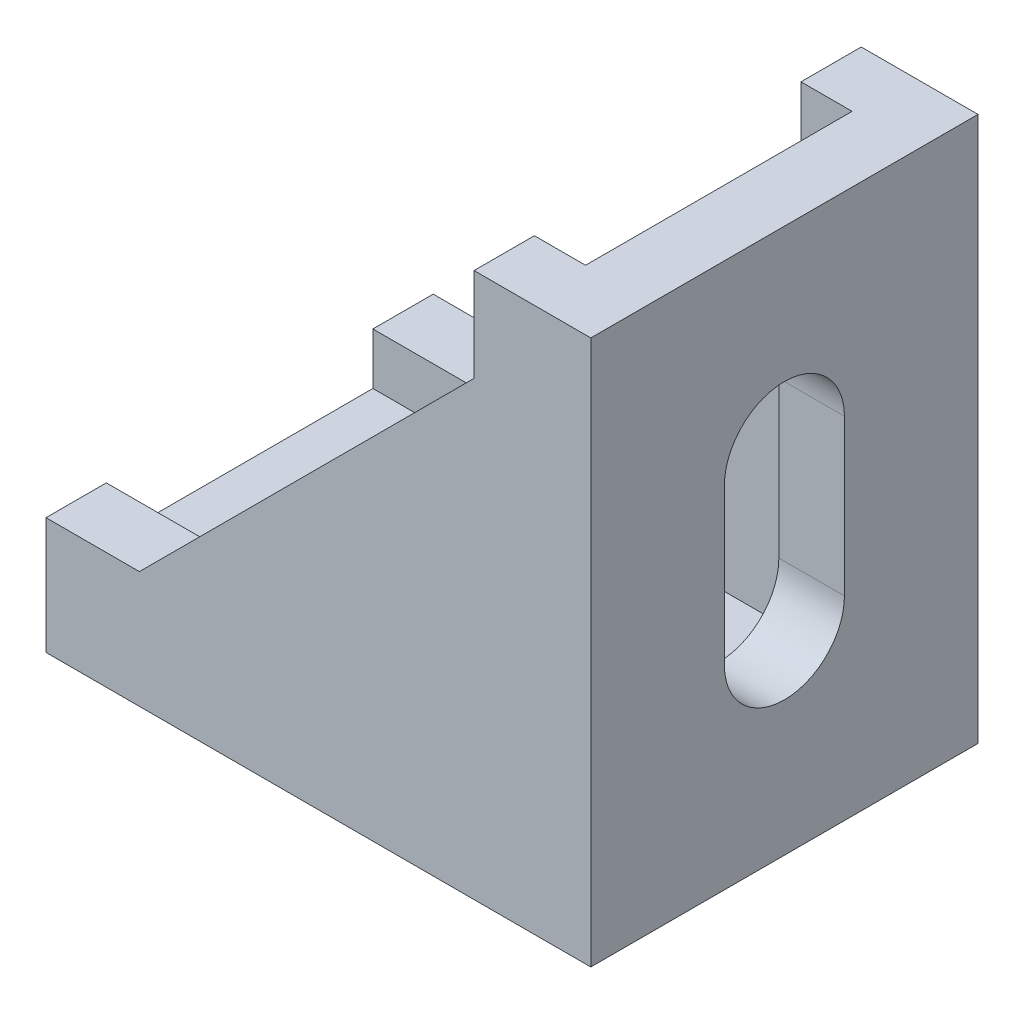
ISO-10303-21;
HEADER;
FILE_DESCRIPTION(('STEP AP214'),'2;1');
FILE_NAME('part.step','',(''),(''),'','','');
FILE_SCHEMA(('AUTOMOTIVE_DESIGN { 1 0 10303 214 1 1 1 1 }'));
ENDSEC;
DATA;
#1=APPLICATION_CONTEXT('core data for automotive mechanical design processes');
#2=APPLICATION_PROTOCOL_DEFINITION('international standard','automotive_design',2000,#1);
#3=PRODUCT_CONTEXT('',#1,'mechanical');
#4=PRODUCT('Part','Part','',(#3));
#5=PRODUCT_RELATED_PRODUCT_CATEGORY('part','',(#4));
#6=PRODUCT_DEFINITION_FORMATION('','',#4);
#7=PRODUCT_DEFINITION_CONTEXT('part definition',#1,'design');
#8=PRODUCT_DEFINITION('design','',#6,#7);
#9=PRODUCT_DEFINITION_SHAPE('','',#8);
#10=(LENGTH_UNIT() NAMED_UNIT(*) SI_UNIT(.MILLI.,.METRE.));
#11=(NAMED_UNIT(*) PLANE_ANGLE_UNIT() SI_UNIT($,.RADIAN.));
#12=(NAMED_UNIT(*) SI_UNIT($,.STERADIAN.) SOLID_ANGLE_UNIT());
#13=UNCERTAINTY_MEASURE_WITH_UNIT(LENGTH_MEASURE(1.E-05),#10,'distance_accuracy_value','');
#14=(GEOMETRIC_REPRESENTATION_CONTEXT(3) GLOBAL_UNCERTAINTY_ASSIGNED_CONTEXT((#13)) GLOBAL_UNIT_ASSIGNED_CONTEXT((#10,
#11,#12)) REPRESENTATION_CONTEXT('',''));
#15=CARTESIAN_POINT('',(0.,0.,0.));
#16=DIRECTION('',(0.,0.,1.));
#17=DIRECTION('',(1.,0.,0.));
#18=AXIS2_PLACEMENT_3D('',#15,#16,#17);
#19=CARTESIAN_POINT('',(0.,3.35,0.));
#20=DIRECTION('',(0.,1.,0.));
#21=DIRECTION('',(0.,0.,1.));
#22=AXIS2_PLACEMENT_3D('',#19,#20,#21);
#23=PLANE('',#22);
#24=DIRECTION('',(0.,0.,1.));
#25=VECTOR('',#24,1.);
#26=CARTESIAN_POINT('',(10.63,3.35,0.));
#27=LINE('',#26,#25);
#28=CARTESIAN_POINT('',(10.63,3.35,-6.85));
#29=VERTEX_POINT('',#28);
#30=CARTESIAN_POINT('',(10.63,3.35,6.85));
#31=VERTEX_POINT('',#30);
#32=EDGE_CURVE('E232',#29,#31,#27,.T.);
#33=ORIENTED_EDGE('',*,*,#32,.F.);
#34=DIRECTION('',(1.,0.,0.));
#35=VECTOR('',#34,1.);
#36=CARTESIAN_POINT('',(0.,3.35,-6.85));
#37=LINE('',#36,#35);
#38=CARTESIAN_POINT('',(-14.,3.35,-6.85));
#39=VERTEX_POINT('',#38);
#40=EDGE_CURVE('E262',#39,#29,#37,.T.);
#41=ORIENTED_EDGE('',*,*,#40,.F.);
#42=DIRECTION('',(0.,0.,1.));
#43=VECTOR('',#42,1.);
#44=CARTESIAN_POINT('',(-14.,3.35,-9.95));
#45=LINE('',#44,#43);
#46=CARTESIAN_POINT('',(-14.,3.35,6.84999999999999));
#47=VERTEX_POINT('',#46);
#48=EDGE_CURVE('E340',#39,#47,#45,.T.);
#49=ORIENTED_EDGE('',*,*,#48,.T.);
#50=DIRECTION('',(1.,0.,0.));
#51=VECTOR('',#50,1.);
#52=CARTESIAN_POINT('',(0.,3.35,6.85));
#53=LINE('',#52,#51);
#54=EDGE_CURVE('E296',#47,#31,#53,.T.);
#55=ORIENTED_EDGE('',*,*,#54,.T.);
#56=EDGE_LOOP('',(#33,#41,#49,#55));
#57=FACE_BOUND('',#56,.T.);
#58=DIRECTION('',(1.,0.,0.));
#59=VECTOR('',#58,1.);
#60=CARTESIAN_POINT('',(-4.,3.35,3.085));
#61=LINE('',#60,#59);
#62=CARTESIAN_POINT('',(-4.,3.35,3.085));
#63=VERTEX_POINT('',#62);
#64=CARTESIAN_POINT('',(4.,3.35,3.085));
#65=VERTEX_POINT('',#64);
#66=EDGE_CURVE('E311',#63,#65,#61,.T.);
#67=ORIENTED_EDGE('',*,*,#66,.F.);
#68=CARTESIAN_POINT('',(-4.,3.35,0.));
#69=DIRECTION('',(0.,1.,0.));
#70=DIRECTION('',(0.,0.,1.));
#71=AXIS2_PLACEMENT_3D('',#68,#69,#70);
#72=CIRCLE('',#71,3.085);
#73=CARTESIAN_POINT('',(-4.,3.35,-3.085));
#74=VERTEX_POINT('',#73);
#75=EDGE_CURVE('E309',#74,#63,#72,.T.);
#76=ORIENTED_EDGE('',*,*,#75,.F.);
#77=DIRECTION('',(-1.,0.,0.));
#78=VECTOR('',#77,1.);
#79=CARTESIAN_POINT('',(-4.,3.35,-3.085));
#80=LINE('',#79,#78);
#81=CARTESIAN_POINT('',(4.,3.35,-3.085));
#82=VERTEX_POINT('',#81);
#83=EDGE_CURVE('E317',#82,#74,#80,.T.);
#84=ORIENTED_EDGE('',*,*,#83,.F.);
#85=CARTESIAN_POINT('',(4.,3.35,0.));
#86=DIRECTION('',(0.,1.,0.));
#87=DIRECTION('',(0.,0.,1.));
#88=AXIS2_PLACEMENT_3D('',#85,#86,#87);
#89=CIRCLE('',#88,3.085);
#90=EDGE_CURVE('E314',#65,#82,#89,.T.);
#91=ORIENTED_EDGE('',*,*,#90,.F.);
#92=EDGE_LOOP('',(#67,#76,#84,#91));
#93=FACE_BOUND('',#92,.T.);
#94=ADVANCED_FACE('F38',(#57,#93),#23,.T.);
#95=CARTESIAN_POINT('',(0.,0.,0.));
#96=DIRECTION('',(0.,1.,0.));
#97=DIRECTION('',(0.,0.,1.));
#98=AXIS2_PLACEMENT_3D('',#95,#96,#97);
#99=PLANE('',#98);
#100=DIRECTION('',(0.,0.,1.));
#101=VECTOR('',#100,1.);
#102=CARTESIAN_POINT('',(-14.,0.,-9.95));
#103=LINE('',#102,#101);
#104=CARTESIAN_POINT('',(-14.,0.,-9.95));
#105=VERTEX_POINT('',#104);
#106=CARTESIAN_POINT('',(-14.,0.,9.95));
#107=VERTEX_POINT('',#106);
#108=EDGE_CURVE('E347',#105,#107,#103,.T.);
#109=ORIENTED_EDGE('',*,*,#108,.F.);
#110=DIRECTION('',(-1.,0.,0.));
#111=VECTOR('',#110,1.);
#112=CARTESIAN_POINT('',(-14.,0.,-9.95));
#113=LINE('',#112,#111);
#114=CARTESIAN_POINT('',(14.,0.,-9.95));
#115=VERTEX_POINT('',#114);
#116=EDGE_CURVE('E345',#115,#105,#113,.T.);
#117=ORIENTED_EDGE('',*,*,#116,.F.);
#118=DIRECTION('',(0.,0.,-1.));
#119=VECTOR('',#118,1.);
#120=CARTESIAN_POINT('',(14.,0.,-9.95));
#121=LINE('',#120,#119);
#122=CARTESIAN_POINT('',(14.,0.,9.95));
#123=VERTEX_POINT('',#122);
#124=EDGE_CURVE('E339',#123,#115,#121,.T.);
#125=ORIENTED_EDGE('',*,*,#124,.F.);
#126=DIRECTION('',(1.,0.,0.));
#127=VECTOR('',#126,1.);
#128=CARTESIAN_POINT('',(-14.,0.,9.95));
#129=LINE('',#128,#127);
#130=EDGE_CURVE('E343',#107,#123,#129,.T.);
#131=ORIENTED_EDGE('',*,*,#130,.F.);
#132=EDGE_LOOP('',(#109,#117,#125,#131));
#133=FACE_BOUND('',#132,.T.);
#134=CARTESIAN_POINT('',(-4.,0.,0.));
#135=DIRECTION('',(0.,1.,0.));
#136=DIRECTION('',(0.,0.,1.));
#137=AXIS2_PLACEMENT_3D('',#134,#135,#136);
#138=CIRCLE('',#137,3.085);
#139=CARTESIAN_POINT('',(-4.,0.,-3.085));
#140=VERTEX_POINT('',#139);
#141=CARTESIAN_POINT('',(-4.,0.,3.085));
#142=VERTEX_POINT('',#141);
#143=EDGE_CURVE('E308',#140,#142,#138,.T.);
#144=ORIENTED_EDGE('',*,*,#143,.T.);
#145=DIRECTION('',(1.,0.,0.));
#146=VECTOR('',#145,1.);
#147=CARTESIAN_POINT('',(-4.,0.,3.085));
#148=LINE('',#147,#146);
#149=CARTESIAN_POINT('',(4.,0.,3.085));
#150=VERTEX_POINT('',#149);
#151=EDGE_CURVE('E322',#142,#150,#148,.T.);
#152=ORIENTED_EDGE('',*,*,#151,.T.);
#153=CARTESIAN_POINT('',(4.,0.,0.));
#154=DIRECTION('',(0.,1.,0.));
#155=DIRECTION('',(0.,0.,1.));
#156=AXIS2_PLACEMENT_3D('',#153,#154,#155);
#157=CIRCLE('',#156,3.085);
#158=CARTESIAN_POINT('',(4.,0.,-3.085));
#159=VERTEX_POINT('',#158);
#160=EDGE_CURVE('E325',#150,#159,#157,.T.);
#161=ORIENTED_EDGE('',*,*,#160,.T.);
#162=DIRECTION('',(-1.,0.,0.));
#163=VECTOR('',#162,1.);
#164=CARTESIAN_POINT('',(-4.,0.,-3.085));
#165=LINE('',#164,#163);
#166=EDGE_CURVE('E312',#159,#140,#165,.T.);
#167=ORIENTED_EDGE('',*,*,#166,.T.);
#168=EDGE_LOOP('',(#144,#152,#161,#167));
#169=FACE_BOUND('',#168,.T.);
#170=ADVANCED_FACE('F370',(#133,#169),#99,.F.);
#171=CARTESIAN_POINT('',(14.,3.35,-9.95));
#172=DIRECTION('',(-1.,0.,0.));
#173=DIRECTION('',(0.,0.,1.));
#174=AXIS2_PLACEMENT_3D('',#171,#172,#173);
#175=PLANE('',#174);
#176=DIRECTION('',(0.,-1.,0.));
#177=VECTOR('',#176,1.);
#178=CARTESIAN_POINT('',(14.,3.35,-9.95));
#179=LINE('',#178,#177);
#180=CARTESIAN_POINT('',(14.,28.,-9.95));
#181=VERTEX_POINT('',#180);
#182=EDGE_CURVE('E46',#181,#115,#179,.T.);
#183=ORIENTED_EDGE('',*,*,#182,.F.);
#184=DIRECTION('',(0.,0.,1.));
#185=VECTOR('',#184,1.);
#186=CARTESIAN_POINT('',(14.,28.,6.85));
#187=LINE('',#186,#185);
#188=CARTESIAN_POINT('',(14.,28.,9.95));
#189=VERTEX_POINT('',#188);
#190=EDGE_CURVE('E284',#181,#189,#187,.T.);
#191=ORIENTED_EDGE('',*,*,#190,.T.);
#192=DIRECTION('',(0.,-1.,0.));
#193=VECTOR('',#192,1.);
#194=CARTESIAN_POINT('',(14.,3.35,9.95));
#195=LINE('',#194,#193);
#196=EDGE_CURVE('E342',#189,#123,#195,.T.);
#197=ORIENTED_EDGE('',*,*,#196,.T.);
#198=ORIENTED_EDGE('',*,*,#124,.T.);
#199=EDGE_LOOP('',(#183,#191,#197,#198));
#200=FACE_BOUND('',#199,.T.);
#201=DIRECTION('',(0.,-1.,0.));
#202=VECTOR('',#201,1.);
#203=CARTESIAN_POINT('',(14.,18.,3.085));
#204=LINE('',#203,#202);
#205=CARTESIAN_POINT('',(14.,18.,3.085));
#206=VERTEX_POINT('',#205);
#207=CARTESIAN_POINT('',(14.,10.,3.085));
#208=VERTEX_POINT('',#207);
#209=EDGE_CURVE('E220',#206,#208,#204,.T.);
#210=ORIENTED_EDGE('',*,*,#209,.F.);
#211=CARTESIAN_POINT('',(14.,18.,0.));
#212=DIRECTION('',(1.,0.,0.));
#213=DIRECTION('',(0.,0.,-1.));
#214=AXIS2_PLACEMENT_3D('',#211,#212,#213);
#215=CIRCLE('',#214,3.085);
#216=CARTESIAN_POINT('',(14.,18.,-3.085));
#217=VERTEX_POINT('',#216);
#218=EDGE_CURVE('E193',#217,#206,#215,.T.);
#219=ORIENTED_EDGE('',*,*,#218,.F.);
#220=DIRECTION('',(0.,1.,0.));
#221=VECTOR('',#220,1.);
#222=CARTESIAN_POINT('',(14.,18.,-3.085));
#223=LINE('',#222,#221);
#224=CARTESIAN_POINT('',(14.,10.,-3.085));
#225=VERTEX_POINT('',#224);
#226=EDGE_CURVE('E211',#225,#217,#223,.T.);
#227=ORIENTED_EDGE('',*,*,#226,.F.);
#228=CARTESIAN_POINT('',(14.,10.,0.));
#229=DIRECTION('',(1.,0.,0.));
#230=DIRECTION('',(0.,0.,-1.));
#231=AXIS2_PLACEMENT_3D('',#228,#229,#230);
#232=CIRCLE('',#231,3.085);
#233=EDGE_CURVE('E214',#208,#225,#232,.T.);
#234=ORIENTED_EDGE('',*,*,#233,.F.);
#235=EDGE_LOOP('',(#210,#219,#227,#234));
#236=FACE_BOUND('',#235,.T.);
#237=ADVANCED_FACE('F40',(#200,#236),#175,.F.);
#238=CARTESIAN_POINT('',(-14.,3.35,-9.95));
#239=DIRECTION('',(0.,0.,1.));
#240=DIRECTION('',(1.,0.,0.));
#241=AXIS2_PLACEMENT_3D('',#238,#239,#240);
#242=PLANE('',#241);
#243=DIRECTION('',(0.,1.,0.));
#244=VECTOR('',#243,1.);
#245=CARTESIAN_POINT('',(8.,0.,-9.95));
#246=LINE('',#245,#244);
#247=CARTESIAN_POINT('',(8.,23.2,-9.95));
#248=VERTEX_POINT('',#247);
#249=CARTESIAN_POINT('',(8.,28.,-9.95));
#250=VERTEX_POINT('',#249);
#251=EDGE_CURVE('E239',#248,#250,#246,.T.);
#252=ORIENTED_EDGE('',*,*,#251,.T.);
#253=DIRECTION('',(-1.,0.,0.));
#254=VECTOR('',#253,1.);
#255=CARTESIAN_POINT('',(0.,28.,-9.95));
#256=LINE('',#255,#254);
#257=EDGE_CURVE('E237',#181,#250,#256,.T.);
#258=ORIENTED_EDGE('',*,*,#257,.F.);
#259=ORIENTED_EDGE('',*,*,#182,.T.);
#260=ORIENTED_EDGE('',*,*,#116,.T.);
#261=DIRECTION('',(0.,-1.,0.));
#262=VECTOR('',#261,1.);
#263=CARTESIAN_POINT('',(-14.,3.35,-9.95));
#264=LINE('',#263,#262);
#265=CARTESIAN_POINT('',(-14.,6.,-9.95));
#266=VERTEX_POINT('',#265);
#267=EDGE_CURVE('E355',#266,#105,#264,.T.);
#268=ORIENTED_EDGE('',*,*,#267,.F.);
#269=DIRECTION('',(-1.,0.,0.));
#270=VECTOR('',#269,1.);
#271=CARTESIAN_POINT('',(0.,6.,-9.95));
#272=LINE('',#271,#270);
#273=CARTESIAN_POINT('',(-9.2,6.,-9.95));
#274=VERTEX_POINT('',#273);
#275=EDGE_CURVE('E245',#274,#266,#272,.T.);
#276=ORIENTED_EDGE('',*,*,#275,.F.);
#277=DIRECTION('',(0.707106781186548,0.707106781186548,0.));
#278=VECTOR('',#277,1.);
#279=CARTESIAN_POINT('',(-7.6,7.6,-9.95));
#280=LINE('',#279,#278);
#281=EDGE_CURVE('E243',#274,#248,#280,.T.);
#282=ORIENTED_EDGE('',*,*,#281,.T.);
#283=EDGE_LOOP('',(#252,#258,#259,#260,#268,#276,#282));
#284=FACE_BOUND('',#283,.T.);
#285=ADVANCED_FACE('F361',(#284),#242,.F.);
#286=CARTESIAN_POINT('',(-14.,3.35,-9.95));
#287=DIRECTION('',(1.,0.,0.));
#288=DIRECTION('',(0.,0.,-1.));
#289=AXIS2_PLACEMENT_3D('',#286,#287,#288);
#290=PLANE('',#289);
#291=ORIENTED_EDGE('',*,*,#48,.F.);
#292=DIRECTION('',(0.,1.,0.));
#293=VECTOR('',#292,1.);
#294=CARTESIAN_POINT('',(-14.,0.,-6.85));
#295=LINE('',#294,#293);
#296=CARTESIAN_POINT('',(-14.,6.,-6.85));
#297=VERTEX_POINT('',#296);
#298=EDGE_CURVE('E236',#39,#297,#295,.T.);
#299=ORIENTED_EDGE('',*,*,#298,.T.);
#300=DIRECTION('',(0.,0.,1.));
#301=VECTOR('',#300,1.);
#302=CARTESIAN_POINT('',(-14.,6.,-9.95));
#303=LINE('',#302,#301);
#304=EDGE_CURVE('E259',#266,#297,#303,.T.);
#305=ORIENTED_EDGE('',*,*,#304,.F.);
#306=ORIENTED_EDGE('',*,*,#267,.T.);
#307=ORIENTED_EDGE('',*,*,#108,.T.);
#308=DIRECTION('',(0.,-1.,0.));
#309=VECTOR('',#308,1.);
#310=CARTESIAN_POINT('',(-14.,3.35,9.95));
#311=LINE('',#310,#309);
#312=CARTESIAN_POINT('',(-14.,6.,9.95));
#313=VERTEX_POINT('',#312);
#314=EDGE_CURVE('E352',#313,#107,#311,.T.);
#315=ORIENTED_EDGE('',*,*,#314,.F.);
#316=DIRECTION('',(0.,0.,1.));
#317=VECTOR('',#316,1.);
#318=CARTESIAN_POINT('',(-14.,6.,6.85));
#319=LINE('',#318,#317);
#320=CARTESIAN_POINT('',(-14.,6.,6.85));
#321=VERTEX_POINT('',#320);
#322=EDGE_CURVE('E293',#321,#313,#319,.T.);
#323=ORIENTED_EDGE('',*,*,#322,.F.);
#324=DIRECTION('',(0.,1.,0.));
#325=VECTOR('',#324,1.);
#326=CARTESIAN_POINT('',(-14.,0.,6.85));
#327=LINE('',#326,#325);
#328=EDGE_CURVE('E273',#47,#321,#327,.T.);
#329=ORIENTED_EDGE('',*,*,#328,.F.);
#330=EDGE_LOOP('',(#291,#299,#305,#306,#307,#315,#323,#329));
#331=FACE_BOUND('',#330,.T.);
#332=ADVANCED_FACE('F374',(#331),#290,.F.);
#333=CARTESIAN_POINT('',(-14.,3.35,9.95));
#334=DIRECTION('',(0.,0.,-1.));
#335=DIRECTION('',(-1.,0.,0.));
#336=AXIS2_PLACEMENT_3D('',#333,#334,#335);
#337=PLANE('',#336);
#338=ORIENTED_EDGE('',*,*,#130,.T.);
#339=ORIENTED_EDGE('',*,*,#196,.F.);
#340=DIRECTION('',(-1.,0.,0.));
#341=VECTOR('',#340,1.);
#342=CARTESIAN_POINT('',(0.,28.,9.95));
#343=LINE('',#342,#341);
#344=CARTESIAN_POINT('',(8.,28.,9.95));
#345=VERTEX_POINT('',#344);
#346=EDGE_CURVE('E272',#189,#345,#343,.T.);
#347=ORIENTED_EDGE('',*,*,#346,.T.);
#348=DIRECTION('',(0.,1.,0.));
#349=VECTOR('',#348,1.);
#350=CARTESIAN_POINT('',(8.,0.,9.95));
#351=LINE('',#350,#349);
#352=CARTESIAN_POINT('',(8.,23.2,9.95));
#353=VERTEX_POINT('',#352);
#354=EDGE_CURVE('E286',#353,#345,#351,.T.);
#355=ORIENTED_EDGE('',*,*,#354,.F.);
#356=DIRECTION('',(0.707106781186548,0.707106781186548,0.));
#357=VECTOR('',#356,1.);
#358=CARTESIAN_POINT('',(-7.6,7.6,9.95));
#359=LINE('',#358,#357);
#360=CARTESIAN_POINT('',(-9.2,6.,9.95));
#361=VERTEX_POINT('',#360);
#362=EDGE_CURVE('E289',#361,#353,#359,.T.);
#363=ORIENTED_EDGE('',*,*,#362,.F.);
#364=DIRECTION('',(-1.,0.,0.));
#365=VECTOR('',#364,1.);
#366=CARTESIAN_POINT('',(0.,6.,9.95));
#367=LINE('',#366,#365);
#368=EDGE_CURVE('E275',#361,#313,#367,.T.);
#369=ORIENTED_EDGE('',*,*,#368,.T.);
#370=ORIENTED_EDGE('',*,*,#314,.T.);
#371=EDGE_LOOP('',(#338,#339,#347,#355,#363,#369,#370));
#372=FACE_BOUND('',#371,.T.);
#373=ADVANCED_FACE('F378',(#372),#337,.F.);
#374=CARTESIAN_POINT('',(-4.,3.35,0.));
#375=DIRECTION('',(0.,-1.,0.));
#376=DIRECTION('',(0.,0.,-1.));
#377=AXIS2_PLACEMENT_3D('',#374,#375,#376);
#378=CYLINDRICAL_SURFACE('',#377,3.085);
#379=ORIENTED_EDGE('',*,*,#143,.F.);
#380=DIRECTION('',(0.,-1.,0.));
#381=VECTOR('',#380,1.);
#382=CARTESIAN_POINT('',(-4.,3.35,-3.085));
#383=LINE('',#382,#381);
#384=EDGE_CURVE('E319',#74,#140,#383,.T.);
#385=ORIENTED_EDGE('',*,*,#384,.F.);
#386=ORIENTED_EDGE('',*,*,#75,.T.);
#387=DIRECTION('',(0.,-1.,0.));
#388=VECTOR('',#387,1.);
#389=CARTESIAN_POINT('',(-4.,3.35,3.085));
#390=LINE('',#389,#388);
#391=EDGE_CURVE('E336',#63,#142,#390,.T.);
#392=ORIENTED_EDGE('',*,*,#391,.T.);
#393=EDGE_LOOP('',(#379,#385,#386,#392));
#394=FACE_BOUND('',#393,.T.);
#395=ADVANCED_FACE('F426',(#394),#378,.F.);
#396=CARTESIAN_POINT('',(-4.,3.35,3.085));
#397=DIRECTION('',(0.,0.,-1.));
#398=DIRECTION('',(-1.,0.,0.));
#399=AXIS2_PLACEMENT_3D('',#396,#397,#398);
#400=PLANE('',#399);
#401=ORIENTED_EDGE('',*,*,#151,.F.);
#402=ORIENTED_EDGE('',*,*,#391,.F.);
#403=ORIENTED_EDGE('',*,*,#66,.T.);
#404=DIRECTION('',(0.,-1.,0.));
#405=VECTOR('',#404,1.);
#406=CARTESIAN_POINT('',(4.,3.35,3.085));
#407=LINE('',#406,#405);
#408=EDGE_CURVE('E334',#65,#150,#407,.T.);
#409=ORIENTED_EDGE('',*,*,#408,.T.);
#410=EDGE_LOOP('',(#401,#402,#403,#409));
#411=FACE_BOUND('',#410,.T.);
#412=ADVANCED_FACE('F525',(#411),#400,.T.);
#413=CARTESIAN_POINT('',(4.,3.35,0.));
#414=DIRECTION('',(0.,-1.,0.));
#415=DIRECTION('',(0.,0.,-1.));
#416=AXIS2_PLACEMENT_3D('',#413,#414,#415);
#417=CYLINDRICAL_SURFACE('',#416,3.085);
#418=ORIENTED_EDGE('',*,*,#160,.F.);
#419=ORIENTED_EDGE('',*,*,#408,.F.);
#420=ORIENTED_EDGE('',*,*,#90,.T.);
#421=DIRECTION('',(0.,-1.,0.));
#422=VECTOR('',#421,1.);
#423=CARTESIAN_POINT('',(4.,3.35,-3.085));
#424=LINE('',#423,#422);
#425=EDGE_CURVE('E332',#82,#159,#424,.T.);
#426=ORIENTED_EDGE('',*,*,#425,.T.);
#427=EDGE_LOOP('',(#418,#419,#420,#426));
#428=FACE_BOUND('',#427,.T.);
#429=ADVANCED_FACE('F515',(#428),#417,.F.);
#430=CARTESIAN_POINT('',(-4.,3.35,-3.085));
#431=DIRECTION('',(0.,0.,1.));
#432=DIRECTION('',(1.,0.,0.));
#433=AXIS2_PLACEMENT_3D('',#430,#431,#432);
#434=PLANE('',#433);
#435=ORIENTED_EDGE('',*,*,#166,.F.);
#436=ORIENTED_EDGE('',*,*,#425,.F.);
#437=ORIENTED_EDGE('',*,*,#83,.T.);
#438=ORIENTED_EDGE('',*,*,#384,.T.);
#439=EDGE_LOOP('',(#435,#436,#437,#438));
#440=FACE_BOUND('',#439,.T.);
#441=ADVANCED_FACE('F506',(#440),#434,.T.);
#442=CARTESIAN_POINT('',(0.,6.,6.85));
#443=DIRECTION('',(0.,1.,0.));
#444=DIRECTION('',(-1.,0.,0.));
#445=AXIS2_PLACEMENT_3D('',#442,#443,#444);
#446=PLANE('',#445);
#447=ORIENTED_EDGE('',*,*,#368,.F.);
#448=DIRECTION('',(0.,0.,1.));
#449=VECTOR('',#448,1.);
#450=CARTESIAN_POINT('',(-9.2,6.,6.85));
#451=LINE('',#450,#449);
#452=CARTESIAN_POINT('',(-9.2,6.,6.85));
#453=VERTEX_POINT('',#452);
#454=EDGE_CURVE('E297',#453,#361,#451,.T.);
#455=ORIENTED_EDGE('',*,*,#454,.F.);
#456=DIRECTION('',(-1.,0.,0.));
#457=VECTOR('',#456,1.);
#458=CARTESIAN_POINT('',(0.,6.,6.85));
#459=LINE('',#458,#457);
#460=EDGE_CURVE('E281',#453,#321,#459,.T.);
#461=ORIENTED_EDGE('',*,*,#460,.T.);
#462=ORIENTED_EDGE('',*,*,#322,.T.);
#463=EDGE_LOOP('',(#447,#455,#461,#462));
#464=FACE_BOUND('',#463,.T.);
#465=ADVANCED_FACE('F383',(#464),#446,.T.);
#466=CARTESIAN_POINT('',(-7.6,7.6,6.85));
#467=DIRECTION('',(0.707106781186547,-0.707106781186547,0.));
#468=DIRECTION('',(0.707106781186548,0.707106781186548,0.));
#469=AXIS2_PLACEMENT_3D('',#466,#467,#468);
#470=PLANE('',#469);
#471=ORIENTED_EDGE('',*,*,#362,.T.);
#472=DIRECTION('',(0.,0.,1.));
#473=VECTOR('',#472,1.);
#474=CARTESIAN_POINT('',(8.,23.2,6.85));
#475=LINE('',#474,#473);
#476=CARTESIAN_POINT('',(8.,23.2,6.85));
#477=VERTEX_POINT('',#476);
#478=EDGE_CURVE('E299',#477,#353,#475,.T.);
#479=ORIENTED_EDGE('',*,*,#478,.F.);
#480=DIRECTION('',(0.707106781186548,0.707106781186548,0.));
#481=VECTOR('',#480,1.);
#482=CARTESIAN_POINT('',(-7.6,7.6,6.85));
#483=LINE('',#482,#481);
#484=EDGE_CURVE('E279',#453,#477,#483,.T.);
#485=ORIENTED_EDGE('',*,*,#484,.F.);
#486=ORIENTED_EDGE('',*,*,#454,.T.);
#487=EDGE_LOOP('',(#471,#479,#485,#486));
#488=FACE_BOUND('',#487,.T.);
#489=ADVANCED_FACE('F485',(#488),#470,.F.);
#490=CARTESIAN_POINT('',(8.,0.,6.85));
#491=DIRECTION('',(1.,0.,0.));
#492=DIRECTION('',(0.,0.,-1.));
#493=AXIS2_PLACEMENT_3D('',#490,#491,#492);
#494=PLANE('',#493);
#495=ORIENTED_EDGE('',*,*,#354,.T.);
#496=DIRECTION('',(0.,0.,1.));
#497=VECTOR('',#496,1.);
#498=CARTESIAN_POINT('',(8.,28.,6.85));
#499=LINE('',#498,#497);
#500=CARTESIAN_POINT('',(8.,28.,6.85));
#501=VERTEX_POINT('',#500);
#502=EDGE_CURVE('E302',#501,#345,#499,.T.);
#503=ORIENTED_EDGE('',*,*,#502,.F.);
#504=DIRECTION('',(0.,1.,0.));
#505=VECTOR('',#504,1.);
#506=CARTESIAN_POINT('',(8.,0.,6.85));
#507=LINE('',#506,#505);
#508=EDGE_CURVE('E277',#477,#501,#507,.T.);
#509=ORIENTED_EDGE('',*,*,#508,.F.);
#510=ORIENTED_EDGE('',*,*,#478,.T.);
#511=EDGE_LOOP('',(#495,#503,#509,#510));
#512=FACE_BOUND('',#511,.T.);
#513=ADVANCED_FACE('F480',(#512),#494,.F.);
#514=CARTESIAN_POINT('',(0.,28.,6.85));
#515=DIRECTION('',(0.,1.,0.));
#516=DIRECTION('',(-1.,0.,0.));
#517=AXIS2_PLACEMENT_3D('',#514,#515,#516);
#518=PLANE('',#517);
#519=ORIENTED_EDGE('',*,*,#502,.T.);
#520=ORIENTED_EDGE('',*,*,#346,.F.);
#521=ORIENTED_EDGE('',*,*,#190,.F.);
#522=ORIENTED_EDGE('',*,*,#257,.T.);
#523=DIRECTION('',(0.,0.,1.));
#524=VECTOR('',#523,1.);
#525=CARTESIAN_POINT('',(8.,28.,-9.95));
#526=LINE('',#525,#524);
#527=CARTESIAN_POINT('',(8.,28.,-6.85));
#528=VERTEX_POINT('',#527);
#529=EDGE_CURVE('E248',#250,#528,#526,.T.);
#530=ORIENTED_EDGE('',*,*,#529,.T.);
#531=DIRECTION('',(-1.,0.,0.));
#532=VECTOR('',#531,1.);
#533=CARTESIAN_POINT('',(0.,28.,-6.85));
#534=LINE('',#533,#532);
#535=CARTESIAN_POINT('',(10.63,28.,-6.85));
#536=VERTEX_POINT('',#535);
#537=EDGE_CURVE('E250',#536,#528,#534,.T.);
#538=ORIENTED_EDGE('',*,*,#537,.F.);
#539=DIRECTION('',(0.,0.,1.));
#540=VECTOR('',#539,1.);
#541=CARTESIAN_POINT('',(10.63,28.,9.95));
#542=LINE('',#541,#540);
#543=CARTESIAN_POINT('',(10.63,28.,6.85));
#544=VERTEX_POINT('',#543);
#545=EDGE_CURVE('E226',#536,#544,#542,.T.);
#546=ORIENTED_EDGE('',*,*,#545,.T.);
#547=DIRECTION('',(-1.,0.,0.));
#548=VECTOR('',#547,1.);
#549=CARTESIAN_POINT('',(0.,28.,6.85));
#550=LINE('',#549,#548);
#551=EDGE_CURVE('E53',#544,#501,#550,.T.);
#552=ORIENTED_EDGE('',*,*,#551,.T.);
#553=EDGE_LOOP('',(#519,#520,#521,#522,#530,#538,#546,#552));
#554=FACE_BOUND('',#553,.T.);
#555=ADVANCED_FACE('F397',(#554),#518,.T.);
#556=CARTESIAN_POINT('',(0.,0.,6.85));
#557=DIRECTION('',(0.,0.,1.));
#558=DIRECTION('',(1.,0.,0.));
#559=AXIS2_PLACEMENT_3D('',#556,#557,#558);
#560=PLANE('',#559);
#561=ORIENTED_EDGE('',*,*,#551,.F.);
#562=DIRECTION('',(0.,-1.,0.));
#563=VECTOR('',#562,1.);
#564=CARTESIAN_POINT('',(10.63,0.,6.85));
#565=LINE('',#564,#563);
#566=EDGE_CURVE('E57',#544,#31,#565,.T.);
#567=ORIENTED_EDGE('',*,*,#566,.T.);
#568=ORIENTED_EDGE('',*,*,#54,.F.);
#569=ORIENTED_EDGE('',*,*,#328,.T.);
#570=ORIENTED_EDGE('',*,*,#460,.F.);
#571=ORIENTED_EDGE('',*,*,#484,.T.);
#572=ORIENTED_EDGE('',*,*,#508,.T.);
#573=EDGE_LOOP('',(#561,#567,#568,#569,#570,#571,#572));
#574=FACE_BOUND('',#573,.T.);
#575=ADVANCED_FACE('F388',(#574),#560,.F.);
#576=CARTESIAN_POINT('',(0.,6.,-9.95));
#577=DIRECTION('',(0.,1.,0.));
#578=DIRECTION('',(-1.,0.,0.));
#579=AXIS2_PLACEMENT_3D('',#576,#577,#578);
#580=PLANE('',#579);
#581=DIRECTION('',(-1.,0.,0.));
#582=VECTOR('',#581,1.);
#583=CARTESIAN_POINT('',(0.,6.,-6.85));
#584=LINE('',#583,#582);
#585=CARTESIAN_POINT('',(-9.2,6.,-6.85));
#586=VERTEX_POINT('',#585);
#587=EDGE_CURVE('E240',#586,#297,#584,.T.);
#588=ORIENTED_EDGE('',*,*,#587,.F.);
#589=DIRECTION('',(0.,0.,1.));
#590=VECTOR('',#589,1.);
#591=CARTESIAN_POINT('',(-9.2,6.,-9.95));
#592=LINE('',#591,#590);
#593=EDGE_CURVE('E263',#274,#586,#592,.T.);
#594=ORIENTED_EDGE('',*,*,#593,.F.);
#595=ORIENTED_EDGE('',*,*,#275,.T.);
#596=ORIENTED_EDGE('',*,*,#304,.T.);
#597=EDGE_LOOP('',(#588,#594,#595,#596));
#598=FACE_BOUND('',#597,.T.);
#599=ADVANCED_FACE('F407',(#598),#580,.T.);
#600=CARTESIAN_POINT('',(-7.6,7.6,-9.95));
#601=DIRECTION('',(0.707106781186547,-0.707106781186547,0.));
#602=DIRECTION('',(0.707106781186548,0.707106781186548,0.));
#603=AXIS2_PLACEMENT_3D('',#600,#601,#602);
#604=PLANE('',#603);
#605=DIRECTION('',(0.707106781186548,0.707106781186548,0.));
#606=VECTOR('',#605,1.);
#607=CARTESIAN_POINT('',(-7.6,7.6,-6.85));
#608=LINE('',#607,#606);
#609=CARTESIAN_POINT('',(8.,23.2,-6.85));
#610=VERTEX_POINT('',#609);
#611=EDGE_CURVE('E255',#586,#610,#608,.T.);
#612=ORIENTED_EDGE('',*,*,#611,.T.);
#613=DIRECTION('',(0.,0.,1.));
#614=VECTOR('',#613,1.);
#615=CARTESIAN_POINT('',(8.,23.2,-9.95));
#616=LINE('',#615,#614);
#617=EDGE_CURVE('E265',#248,#610,#616,.T.);
#618=ORIENTED_EDGE('',*,*,#617,.F.);
#619=ORIENTED_EDGE('',*,*,#281,.F.);
#620=ORIENTED_EDGE('',*,*,#593,.T.);
#621=EDGE_LOOP('',(#612,#618,#619,#620));
#622=FACE_BOUND('',#621,.T.);
#623=ADVANCED_FACE('F410',(#622),#604,.F.);
#624=CARTESIAN_POINT('',(8.,0.,-9.95));
#625=DIRECTION('',(1.,0.,0.));
#626=DIRECTION('',(0.,0.,-1.));
#627=AXIS2_PLACEMENT_3D('',#624,#625,#626);
#628=PLANE('',#627);
#629=DIRECTION('',(0.,1.,0.));
#630=VECTOR('',#629,1.);
#631=CARTESIAN_POINT('',(8.,0.,-6.85));
#632=LINE('',#631,#630);
#633=EDGE_CURVE('E252',#610,#528,#632,.T.);
#634=ORIENTED_EDGE('',*,*,#633,.T.);
#635=ORIENTED_EDGE('',*,*,#529,.F.);
#636=ORIENTED_EDGE('',*,*,#251,.F.);
#637=ORIENTED_EDGE('',*,*,#617,.T.);
#638=EDGE_LOOP('',(#634,#635,#636,#637));
#639=FACE_BOUND('',#638,.T.);
#640=ADVANCED_FACE('F401',(#639),#628,.F.);
#641=CARTESIAN_POINT('',(0.,0.,-6.85));
#642=DIRECTION('',(0.,0.,1.));
#643=DIRECTION('',(1.,0.,0.));
#644=AXIS2_PLACEMENT_3D('',#641,#642,#643);
#645=PLANE('',#644);
#646=DIRECTION('',(0.,-1.,0.));
#647=VECTOR('',#646,1.);
#648=CARTESIAN_POINT('',(10.63,0.,-6.85));
#649=LINE('',#648,#647);
#650=EDGE_CURVE('E11',#536,#29,#649,.T.);
#651=ORIENTED_EDGE('',*,*,#650,.F.);
#652=ORIENTED_EDGE('',*,*,#537,.T.);
#653=ORIENTED_EDGE('',*,*,#633,.F.);
#654=ORIENTED_EDGE('',*,*,#611,.F.);
#655=ORIENTED_EDGE('',*,*,#587,.T.);
#656=ORIENTED_EDGE('',*,*,#298,.F.);
#657=ORIENTED_EDGE('',*,*,#40,.T.);
#658=EDGE_LOOP('',(#651,#652,#653,#654,#655,#656,#657));
#659=FACE_BOUND('',#658,.T.);
#660=ADVANCED_FACE('F394',(#659),#645,.T.);
#661=CARTESIAN_POINT('',(10.63,0.,0.));
#662=DIRECTION('',(-1.,0.,0.));
#663=DIRECTION('',(0.,0.,1.));
#664=AXIS2_PLACEMENT_3D('',#661,#662,#663);
#665=PLANE('',#664);
#666=CARTESIAN_POINT('',(10.63,18.,0.));
#667=DIRECTION('',(1.,0.,0.));
#668=DIRECTION('',(0.,0.,-1.));
#669=AXIS2_PLACEMENT_3D('',#666,#667,#668);
#670=CIRCLE('',#669,3.085);
#671=CARTESIAN_POINT('',(10.63,18.,-3.085));
#672=VERTEX_POINT('',#671);
#673=CARTESIAN_POINT('',(10.63,18.,3.085));
#674=VERTEX_POINT('',#673);
#675=EDGE_CURVE('E190',#672,#674,#670,.T.);
#676=ORIENTED_EDGE('',*,*,#675,.T.);
#677=DIRECTION('',(0.,-1.,0.));
#678=VECTOR('',#677,1.);
#679=CARTESIAN_POINT('',(10.63,18.,3.085));
#680=LINE('',#679,#678);
#681=CARTESIAN_POINT('',(10.63,10.,3.085));
#682=VERTEX_POINT('',#681);
#683=EDGE_CURVE('E202',#674,#682,#680,.T.);
#684=ORIENTED_EDGE('',*,*,#683,.T.);
#685=CARTESIAN_POINT('',(10.63,10.,0.));
#686=DIRECTION('',(1.,0.,0.));
#687=DIRECTION('',(0.,0.,-1.));
#688=AXIS2_PLACEMENT_3D('',#685,#686,#687);
#689=CIRCLE('',#688,3.085);
#690=CARTESIAN_POINT('',(10.63,10.,-3.085));
#691=VERTEX_POINT('',#690);
#692=EDGE_CURVE('E206',#682,#691,#689,.T.);
#693=ORIENTED_EDGE('',*,*,#692,.T.);
#694=DIRECTION('',(0.,1.,0.));
#695=VECTOR('',#694,1.);
#696=CARTESIAN_POINT('',(10.63,18.,-3.085));
#697=LINE('',#696,#695);
#698=EDGE_CURVE('E198',#691,#672,#697,.T.);
#699=ORIENTED_EDGE('',*,*,#698,.T.);
#700=EDGE_LOOP('',(#676,#684,#693,#699));
#701=FACE_BOUND('',#700,.T.);
#702=ORIENTED_EDGE('',*,*,#566,.F.);
#703=ORIENTED_EDGE('',*,*,#545,.F.);
#704=ORIENTED_EDGE('',*,*,#650,.T.);
#705=ORIENTED_EDGE('',*,*,#32,.T.);
#706=EDGE_LOOP('',(#702,#703,#704,#705));
#707=FACE_BOUND('',#706,.T.);
#708=ADVANCED_FACE('F208',(#701,#707),#665,.T.);
#709=CARTESIAN_POINT('',(10.63,18.,0.));
#710=DIRECTION('',(1.,0.,0.));
#711=DIRECTION('',(0.,0.,-1.));
#712=AXIS2_PLACEMENT_3D('',#709,#710,#711);
#713=CYLINDRICAL_SURFACE('',#712,3.085);
#714=ORIENTED_EDGE('',*,*,#218,.T.);
#715=DIRECTION('',(1.,0.,0.));
#716=VECTOR('',#715,1.);
#717=CARTESIAN_POINT('',(10.63,18.,3.085));
#718=LINE('',#717,#716);
#719=EDGE_CURVE('E186',#674,#206,#718,.T.);
#720=ORIENTED_EDGE('',*,*,#719,.F.);
#721=ORIENTED_EDGE('',*,*,#675,.F.);
#722=DIRECTION('',(1.,0.,0.));
#723=VECTOR('',#722,1.);
#724=CARTESIAN_POINT('',(10.63,18.,-3.085));
#725=LINE('',#724,#723);
#726=EDGE_CURVE('E224',#672,#217,#725,.T.);
#727=ORIENTED_EDGE('',*,*,#726,.T.);
#728=EDGE_LOOP('',(#714,#720,#721,#727));
#729=FACE_BOUND('',#728,.T.);
#730=ADVANCED_FACE('F188',(#729),#713,.F.);
#731=CARTESIAN_POINT('',(10.63,18.,-3.085));
#732=DIRECTION('',(0.,0.,-1.));
#733=DIRECTION('',(0.,1.,0.));
#734=AXIS2_PLACEMENT_3D('',#731,#732,#733);
#735=PLANE('',#734);
#736=ORIENTED_EDGE('',*,*,#226,.T.);
#737=ORIENTED_EDGE('',*,*,#726,.F.);
#738=ORIENTED_EDGE('',*,*,#698,.F.);
#739=DIRECTION('',(1.,0.,0.));
#740=VECTOR('',#739,1.);
#741=CARTESIAN_POINT('',(10.63,10.,-3.085));
#742=LINE('',#741,#740);
#743=EDGE_CURVE('E227',#691,#225,#742,.T.);
#744=ORIENTED_EDGE('',*,*,#743,.T.);
#745=EDGE_LOOP('',(#736,#737,#738,#744));
#746=FACE_BOUND('',#745,.T.);
#747=ADVANCED_FACE('F595',(#746),#735,.F.);
#748=CARTESIAN_POINT('',(10.63,10.,0.));
#749=DIRECTION('',(1.,0.,0.));
#750=DIRECTION('',(0.,0.,-1.));
#751=AXIS2_PLACEMENT_3D('',#748,#749,#750);
#752=CYLINDRICAL_SURFACE('',#751,3.085);
#753=ORIENTED_EDGE('',*,*,#233,.T.);
#754=ORIENTED_EDGE('',*,*,#743,.F.);
#755=ORIENTED_EDGE('',*,*,#692,.F.);
#756=DIRECTION('',(1.,0.,0.));
#757=VECTOR('',#756,1.);
#758=CARTESIAN_POINT('',(10.63,10.,3.085));
#759=LINE('',#758,#757);
#760=EDGE_CURVE('E197',#682,#208,#759,.T.);
#761=ORIENTED_EDGE('',*,*,#760,.T.);
#762=EDGE_LOOP('',(#753,#754,#755,#761));
#763=FACE_BOUND('',#762,.T.);
#764=ADVANCED_FACE('F604',(#763),#752,.F.);
#765=CARTESIAN_POINT('',(10.63,18.,3.085));
#766=DIRECTION('',(0.,0.,1.));
#767=DIRECTION('',(0.,-1.,0.));
#768=AXIS2_PLACEMENT_3D('',#765,#766,#767);
#769=PLANE('',#768);
#770=ORIENTED_EDGE('',*,*,#209,.T.);
#771=ORIENTED_EDGE('',*,*,#760,.F.);
#772=ORIENTED_EDGE('',*,*,#683,.F.);
#773=ORIENTED_EDGE('',*,*,#719,.T.);
#774=EDGE_LOOP('',(#770,#771,#772,#773));
#775=FACE_BOUND('',#774,.T.);
#776=ADVANCED_FACE('F203',(#775),#769,.F.);
#777=CLOSED_SHELL('',(#94,#170,#237,#285,#332,#373,#395,#412,#429,#441,#465,#489,#513,#555,#575,
#599,#623,#640,#660,#708,#730,#747,#764,#776));
#778=MANIFOLD_SOLID_BREP('B2',#777);
#779=ADVANCED_BREP_SHAPE_REPRESENTATION('',(#18,#778),#14);
#780=SHAPE_DEFINITION_REPRESENTATION(#9,#779);
ENDSEC;
END-ISO-10303-21;
